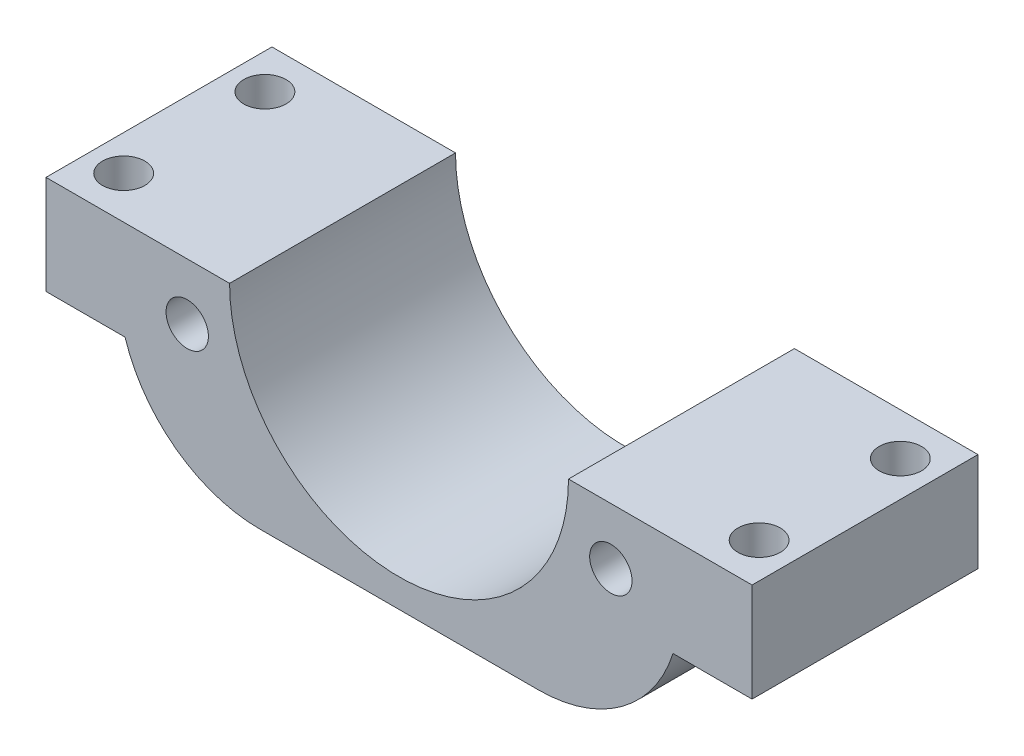
ISO-10303-21;
HEADER;
FILE_DESCRIPTION(('STEP AP214'),'2;1');
FILE_NAME('part.step','',(''),(''),'','','');
FILE_SCHEMA(('AUTOMOTIVE_DESIGN { 1 0 10303 214 1 1 1 1 }'));
ENDSEC;
DATA;
#1=APPLICATION_CONTEXT('core data for automotive mechanical design processes');
#2=APPLICATION_PROTOCOL_DEFINITION('international standard','automotive_design',2000,#1);
#3=PRODUCT_CONTEXT('',#1,'mechanical');
#4=PRODUCT('Part','Part','',(#3));
#5=PRODUCT_RELATED_PRODUCT_CATEGORY('part','',(#4));
#6=PRODUCT_DEFINITION_FORMATION('','',#4);
#7=PRODUCT_DEFINITION_CONTEXT('part definition',#1,'design');
#8=PRODUCT_DEFINITION('design','',#6,#7);
#9=PRODUCT_DEFINITION_SHAPE('','',#8);
#10=(LENGTH_UNIT() NAMED_UNIT(*) SI_UNIT(.MILLI.,.METRE.));
#11=(NAMED_UNIT(*) PLANE_ANGLE_UNIT() SI_UNIT($,.RADIAN.));
#12=(NAMED_UNIT(*) SI_UNIT($,.STERADIAN.) SOLID_ANGLE_UNIT());
#13=UNCERTAINTY_MEASURE_WITH_UNIT(LENGTH_MEASURE(1.E-05),#10,'distance_accuracy_value','');
#14=(GEOMETRIC_REPRESENTATION_CONTEXT(3) GLOBAL_UNCERTAINTY_ASSIGNED_CONTEXT((#13)) GLOBAL_UNIT_ASSIGNED_CONTEXT((#10,
#11,#12)) REPRESENTATION_CONTEXT('',''));
#15=CARTESIAN_POINT('',(0.,0.,0.));
#16=DIRECTION('',(0.,0.,1.));
#17=DIRECTION('',(1.,0.,0.));
#18=AXIS2_PLACEMENT_3D('',#15,#16,#17);
#19=CARTESIAN_POINT('',(23.,14.9,16.));
#20=DIRECTION('',(0.,0.,-1.));
#21=DIRECTION('',(-1.,0.,0.));
#22=AXIS2_PLACEMENT_3D('',#19,#20,#21);
#23=CYLINDRICAL_SURFACE('',#22,12.);
#24=CARTESIAN_POINT('',(23.,14.9,0.));
#25=DIRECTION('',(0.,0.,1.));
#26=DIRECTION('',(1.,0.,0.));
#27=AXIS2_PLACEMENT_3D('',#24,#25,#26);
#28=CIRCLE('',#27,12.);
#29=CARTESIAN_POINT('',(11.,14.9,0.));
#30=VERTEX_POINT('',#29);
#31=CARTESIAN_POINT('',(35.,14.9,0.));
#32=VERTEX_POINT('',#31);
#33=EDGE_CURVE('E117',#30,#32,#28,.T.);
#34=ORIENTED_EDGE('',*,*,#33,.F.);
#35=DIRECTION('',(0.,0.,-1.));
#36=VECTOR('',#35,1.);
#37=CARTESIAN_POINT('',(11.,14.9,16.));
#38=LINE('',#37,#36);
#39=CARTESIAN_POINT('',(11.,14.9,16.));
#40=VERTEX_POINT('',#39);
#41=EDGE_CURVE('E112',#40,#30,#38,.T.);
#42=ORIENTED_EDGE('',*,*,#41,.F.);
#43=CARTESIAN_POINT('',(23.,14.9,16.));
#44=DIRECTION('',(0.,0.,1.));
#45=DIRECTION('',(1.,0.,0.));
#46=AXIS2_PLACEMENT_3D('',#43,#44,#45);
#47=CIRCLE('',#46,12.);
#48=CARTESIAN_POINT('',(35.,14.9,16.));
#49=VERTEX_POINT('',#48);
#50=EDGE_CURVE('E114',#40,#49,#47,.T.);
#51=ORIENTED_EDGE('',*,*,#50,.T.);
#52=DIRECTION('',(0.,0.,-1.));
#53=VECTOR('',#52,1.);
#54=CARTESIAN_POINT('',(35.,14.9,16.));
#55=LINE('',#54,#53);
#56=EDGE_CURVE('E158',#49,#32,#55,.T.);
#57=ORIENTED_EDGE('',*,*,#56,.T.);
#58=EDGE_LOOP('',(#34,#42,#51,#57));
#59=FACE_BOUND('',#58,.T.);
#60=ADVANCED_FACE('F35',(#59),#23,.F.);
#61=CARTESIAN_POINT('',(0.,14.9,16.));
#62=DIRECTION('',(0.,1.,0.));
#63=DIRECTION('',(-1.,0.,0.));
#64=AXIS2_PLACEMENT_3D('',#61,#62,#63);
#65=PLANE('',#64);
#66=CARTESIAN_POINT('',(0.499999999999977,14.9,3.));
#67=DIRECTION('',(0.,-1.,0.));
#68=DIRECTION('',(0.,0.,-1.));
#69=AXIS2_PLACEMENT_3D('',#66,#67,#68);
#70=CIRCLE('',#69,1.5);
#71=CARTESIAN_POINT('',(0.499999999999977,14.9,1.5));
#72=VERTEX_POINT('',#71);
#73=EDGE_CURVE('E305',#72,#72,#70,.T.);
#74=ORIENTED_EDGE('',*,*,#73,.T.);
#75=EDGE_LOOP('',(#74));
#76=FACE_BOUND('',#75,.T.);
#77=CARTESIAN_POINT('',(0.499999999999977,14.9,13.));
#78=DIRECTION('',(0.,-1.,0.));
#79=DIRECTION('',(0.,0.,-1.));
#80=AXIS2_PLACEMENT_3D('',#77,#78,#79);
#81=CIRCLE('',#80,1.5);
#82=CARTESIAN_POINT('',(0.499999999999977,14.9,11.5));
#83=VERTEX_POINT('',#82);
#84=EDGE_CURVE('E161',#83,#83,#81,.T.);
#85=ORIENTED_EDGE('',*,*,#84,.T.);
#86=EDGE_LOOP('',(#85));
#87=FACE_BOUND('',#86,.T.);
#88=DIRECTION('',(1.,0.,0.));
#89=VECTOR('',#88,1.);
#90=CARTESIAN_POINT('',(0.,14.9,0.));
#91=LINE('',#90,#89);
#92=CARTESIAN_POINT('',(-2.00000000000002,14.9,0.));
#93=VERTEX_POINT('',#92);
#94=EDGE_CURVE('E160',#93,#30,#91,.T.);
#95=ORIENTED_EDGE('',*,*,#94,.F.);
#96=DIRECTION('',(0.,0.,-1.));
#97=VECTOR('',#96,1.);
#98=CARTESIAN_POINT('',(-2.00000000000002,14.9,16.));
#99=LINE('',#98,#97);
#100=CARTESIAN_POINT('',(-2.00000000000002,14.9,16.));
#101=VERTEX_POINT('',#100);
#102=EDGE_CURVE('E122',#101,#93,#99,.T.);
#103=ORIENTED_EDGE('',*,*,#102,.F.);
#104=DIRECTION('',(1.,0.,0.));
#105=VECTOR('',#104,1.);
#106=CARTESIAN_POINT('',(0.,14.9,16.));
#107=LINE('',#106,#105);
#108=EDGE_CURVE('E127',#101,#40,#107,.T.);
#109=ORIENTED_EDGE('',*,*,#108,.T.);
#110=ORIENTED_EDGE('',*,*,#41,.T.);
#111=EDGE_LOOP('',(#95,#103,#109,#110));
#112=FACE_BOUND('',#111,.T.);
#113=ADVANCED_FACE('F133',(#76,#87,#112),#65,.T.);
#114=CARTESIAN_POINT('',(-2.00000000000002,0.,16.));
#115=DIRECTION('',(1.,0.,0.));
#116=DIRECTION('',(0.,1.,0.));
#117=AXIS2_PLACEMENT_3D('',#114,#115,#116);
#118=PLANE('',#117);
#119=DIRECTION('',(0.,-1.,0.));
#120=VECTOR('',#119,1.);
#121=CARTESIAN_POINT('',(-2.00000000000002,0.,0.));
#122=LINE('',#121,#120);
#123=CARTESIAN_POINT('',(-2.00000000000002,7.9,0.));
#124=VERTEX_POINT('',#123);
#125=EDGE_CURVE('E163',#93,#124,#122,.T.);
#126=ORIENTED_EDGE('',*,*,#125,.T.);
#127=DIRECTION('',(0.,0.,-1.));
#128=VECTOR('',#127,1.);
#129=CARTESIAN_POINT('',(-2.00000000000002,7.9,16.));
#130=LINE('',#129,#128);
#131=CARTESIAN_POINT('',(-2.00000000000002,7.9,16.));
#132=VERTEX_POINT('',#131);
#133=EDGE_CURVE('E196',#132,#124,#130,.T.);
#134=ORIENTED_EDGE('',*,*,#133,.F.);
#135=DIRECTION('',(0.,-1.,0.));
#136=VECTOR('',#135,1.);
#137=CARTESIAN_POINT('',(-2.00000000000002,0.,16.));
#138=LINE('',#137,#136);
#139=EDGE_CURVE('E135',#101,#132,#138,.T.);
#140=ORIENTED_EDGE('',*,*,#139,.F.);
#141=ORIENTED_EDGE('',*,*,#102,.T.);
#142=EDGE_LOOP('',(#126,#134,#140,#141));
#143=FACE_BOUND('',#142,.T.);
#144=ADVANCED_FACE('F227',(#143),#118,.F.);
#145=CARTESIAN_POINT('',(0.,7.9,16.));
#146=DIRECTION('',(0.,-1.,0.));
#147=DIRECTION('',(0.,0.,-1.));
#148=AXIS2_PLACEMENT_3D('',#145,#146,#147);
#149=PLANE('',#148);
#150=CARTESIAN_POINT('',(0.499999999999977,7.9,3.));
#151=DIRECTION('',(0.,-1.,0.));
#152=DIRECTION('',(0.,0.,-1.));
#153=AXIS2_PLACEMENT_3D('',#150,#151,#152);
#154=CIRCLE('',#153,1.5);
#155=CARTESIAN_POINT('',(0.499999999999977,7.9,1.5));
#156=VERTEX_POINT('',#155);
#157=EDGE_CURVE('E308',#156,#156,#154,.T.);
#158=ORIENTED_EDGE('',*,*,#157,.F.);
#159=EDGE_LOOP('',(#158));
#160=FACE_BOUND('',#159,.T.);
#161=CARTESIAN_POINT('',(0.499999999999977,7.9,13.));
#162=DIRECTION('',(0.,-1.,0.));
#163=DIRECTION('',(0.,0.,-1.));
#164=AXIS2_PLACEMENT_3D('',#161,#162,#163);
#165=CIRCLE('',#164,1.5);
#166=CARTESIAN_POINT('',(0.499999999999977,7.9,11.5));
#167=VERTEX_POINT('',#166);
#168=EDGE_CURVE('E294',#167,#167,#165,.T.);
#169=ORIENTED_EDGE('',*,*,#168,.F.);
#170=EDGE_LOOP('',(#169));
#171=FACE_BOUND('',#170,.T.);
#172=DIRECTION('',(-1.,0.,0.));
#173=VECTOR('',#172,1.);
#174=CARTESIAN_POINT('',(0.,7.9,0.));
#175=LINE('',#174,#173);
#176=CARTESIAN_POINT('',(3.5980762113533,7.9,0.));
#177=VERTEX_POINT('',#176);
#178=EDGE_CURVE('E166',#177,#124,#175,.T.);
#179=ORIENTED_EDGE('',*,*,#178,.F.);
#180=DIRECTION('',(0.,0.,-1.));
#181=VECTOR('',#180,1.);
#182=CARTESIAN_POINT('',(3.5980762113533,7.9,16.));
#183=LINE('',#182,#181);
#184=CARTESIAN_POINT('',(3.5980762113533,7.9,16.));
#185=VERTEX_POINT('',#184);
#186=EDGE_CURVE('E193',#185,#177,#183,.T.);
#187=ORIENTED_EDGE('',*,*,#186,.F.);
#188=DIRECTION('',(-1.,0.,0.));
#189=VECTOR('',#188,1.);
#190=CARTESIAN_POINT('',(0.,7.9,16.));
#191=LINE('',#190,#189);
#192=EDGE_CURVE('E137',#185,#132,#191,.T.);
#193=ORIENTED_EDGE('',*,*,#192,.T.);
#194=ORIENTED_EDGE('',*,*,#133,.T.);
#195=EDGE_LOOP('',(#179,#187,#193,#194));
#196=FACE_BOUND('',#195,.T.);
#197=ADVANCED_FACE('F224',(#160,#171,#196),#149,.T.);
#198=CARTESIAN_POINT('',(0.,0.900000000000003,16.));
#199=DIRECTION('',(0.,1.,0.));
#200=DIRECTION('',(-1.,0.,0.));
#201=AXIS2_PLACEMENT_3D('',#198,#199,#200);
#202=PLANE('',#201);
#203=DIRECTION('',(1.,0.,0.));
#204=VECTOR('',#203,1.);
#205=CARTESIAN_POINT('',(0.,0.900000000000003,16.));
#206=LINE('',#205,#204);
#207=CARTESIAN_POINT('',(13.1374682255228,0.900000000000007,16.));
#208=VERTEX_POINT('',#207);
#209=CARTESIAN_POINT('',(32.8606079858305,0.90000000000001,16.));
#210=VERTEX_POINT('',#209);
#211=EDGE_CURVE('E143',#208,#210,#206,.T.);
#212=ORIENTED_EDGE('',*,*,#211,.F.);
#213=DIRECTION('',(0.,0.,-1.));
#214=VECTOR('',#213,1.);
#215=CARTESIAN_POINT('',(13.1374682255228,0.900000000000006,16.));
#216=LINE('',#215,#214);
#217=CARTESIAN_POINT('',(13.1374682255228,0.900000000000007,0.));
#218=VERTEX_POINT('',#217);
#219=EDGE_CURVE('E200',#208,#218,#216,.T.);
#220=ORIENTED_EDGE('',*,*,#219,.T.);
#221=DIRECTION('',(1.,0.,0.));
#222=VECTOR('',#221,1.);
#223=CARTESIAN_POINT('',(0.,0.900000000000003,0.));
#224=LINE('',#223,#222);
#225=CARTESIAN_POINT('',(32.8606079858305,0.90000000000001,0.));
#226=VERTEX_POINT('',#225);
#227=EDGE_CURVE('E169',#218,#226,#224,.T.);
#228=ORIENTED_EDGE('',*,*,#227,.T.);
#229=DIRECTION('',(0.,0.,-1.));
#230=VECTOR('',#229,1.);
#231=CARTESIAN_POINT('',(32.8606079858305,0.90000000000001,16.));
#232=LINE('',#231,#230);
#233=EDGE_CURVE('E50',#226,#210,#232,.F.);
#234=ORIENTED_EDGE('',*,*,#233,.T.);
#235=EDGE_LOOP('',(#212,#220,#228,#234));
#236=FACE_BOUND('',#235,.T.);
#237=ADVANCED_FACE('F217',(#236),#202,.F.);
#238=CARTESIAN_POINT('',(0.,7.9,16.));
#239=DIRECTION('',(0.,-1.,0.));
#240=DIRECTION('',(1.,0.,0.));
#241=AXIS2_PLACEMENT_3D('',#238,#239,#240);
#242=PLANE('',#241);
#243=CARTESIAN_POINT('',(45.5,7.9,3.));
#244=DIRECTION('',(0.,-1.,0.));
#245=DIRECTION('',(0.,0.,-1.));
#246=AXIS2_PLACEMENT_3D('',#243,#244,#245);
#247=CIRCLE('',#246,1.5);
#248=CARTESIAN_POINT('',(45.5,7.9,1.5));
#249=VERTEX_POINT('',#248);
#250=EDGE_CURVE('E302',#249,#249,#247,.T.);
#251=ORIENTED_EDGE('',*,*,#250,.F.);
#252=EDGE_LOOP('',(#251));
#253=FACE_BOUND('',#252,.T.);
#254=CARTESIAN_POINT('',(45.5,7.9,13.));
#255=DIRECTION('',(0.,-1.,0.));
#256=DIRECTION('',(0.,0.,-1.));
#257=AXIS2_PLACEMENT_3D('',#254,#255,#256);
#258=CIRCLE('',#257,1.5);
#259=CARTESIAN_POINT('',(45.5,7.9,11.5));
#260=VERTEX_POINT('',#259);
#261=EDGE_CURVE('E295',#260,#260,#258,.T.);
#262=ORIENTED_EDGE('',*,*,#261,.F.);
#263=EDGE_LOOP('',(#262));
#264=FACE_BOUND('',#263,.T.);
#265=DIRECTION('',(-1.,0.,0.));
#266=VECTOR('',#265,1.);
#267=CARTESIAN_POINT('',(0.,7.9,0.));
#268=LINE('',#267,#266);
#269=CARTESIAN_POINT('',(48.,7.90000000000001,0.));
#270=VERTEX_POINT('',#269);
#271=CARTESIAN_POINT('',(42.4,7.90000000000001,0.));
#272=VERTEX_POINT('',#271);
#273=EDGE_CURVE('E171',#270,#272,#268,.T.);
#274=ORIENTED_EDGE('',*,*,#273,.F.);
#275=DIRECTION('',(0.,0.,-1.));
#276=VECTOR('',#275,1.);
#277=CARTESIAN_POINT('',(48.,7.90000000000001,16.));
#278=LINE('',#277,#276);
#279=CARTESIAN_POINT('',(48.,7.90000000000001,16.));
#280=VERTEX_POINT('',#279);
#281=EDGE_CURVE('E188',#280,#270,#278,.T.);
#282=ORIENTED_EDGE('',*,*,#281,.F.);
#283=DIRECTION('',(-1.,0.,0.));
#284=VECTOR('',#283,1.);
#285=CARTESIAN_POINT('',(0.,7.9,16.));
#286=LINE('',#285,#284);
#287=CARTESIAN_POINT('',(42.4,7.90000000000001,16.));
#288=VERTEX_POINT('',#287);
#289=EDGE_CURVE('E145',#280,#288,#286,.T.);
#290=ORIENTED_EDGE('',*,*,#289,.T.);
#291=DIRECTION('',(0.,0.,-1.));
#292=VECTOR('',#291,1.);
#293=CARTESIAN_POINT('',(42.4,7.90000000000001,16.));
#294=LINE('',#293,#292);
#295=EDGE_CURVE('E190',#288,#272,#294,.T.);
#296=ORIENTED_EDGE('',*,*,#295,.T.);
#297=EDGE_LOOP('',(#274,#282,#290,#296));
#298=FACE_BOUND('',#297,.T.);
#299=ADVANCED_FACE('F212',(#253,#264,#298),#242,.T.);
#300=CARTESIAN_POINT('',(48.,0.,16.));
#301=DIRECTION('',(1.,0.,0.));
#302=DIRECTION('',(0.,1.,0.));
#303=AXIS2_PLACEMENT_3D('',#300,#301,#302);
#304=PLANE('',#303);
#305=DIRECTION('',(0.,-1.,0.));
#306=VECTOR('',#305,1.);
#307=CARTESIAN_POINT('',(48.,0.,0.));
#308=LINE('',#307,#306);
#309=CARTESIAN_POINT('',(48.,14.9,0.));
#310=VERTEX_POINT('',#309);
#311=EDGE_CURVE('E174',#310,#270,#308,.T.);
#312=ORIENTED_EDGE('',*,*,#311,.F.);
#313=DIRECTION('',(0.,0.,-1.));
#314=VECTOR('',#313,1.);
#315=CARTESIAN_POINT('',(48.,14.9,16.));
#316=LINE('',#315,#314);
#317=CARTESIAN_POINT('',(48.,14.9,16.));
#318=VERTEX_POINT('',#317);
#319=EDGE_CURVE('E186',#318,#310,#316,.T.);
#320=ORIENTED_EDGE('',*,*,#319,.F.);
#321=DIRECTION('',(0.,-1.,0.));
#322=VECTOR('',#321,1.);
#323=CARTESIAN_POINT('',(48.,0.,16.));
#324=LINE('',#323,#322);
#325=EDGE_CURVE('E148',#318,#280,#324,.T.);
#326=ORIENTED_EDGE('',*,*,#325,.T.);
#327=ORIENTED_EDGE('',*,*,#281,.T.);
#328=EDGE_LOOP('',(#312,#320,#326,#327));
#329=FACE_BOUND('',#328,.T.);
#330=ADVANCED_FACE('F233',(#329),#304,.T.);
#331=CARTESIAN_POINT('',(38.,10.9,16.));
#332=DIRECTION('',(0.,0.,-1.));
#333=DIRECTION('',(-1.,0.,0.));
#334=AXIS2_PLACEMENT_3D('',#331,#332,#333);
#335=CYLINDRICAL_SURFACE('',#334,1.5);
#336=CARTESIAN_POINT('',(38.,10.9,16.));
#337=DIRECTION('',(0.,0.,1.));
#338=DIRECTION('',(1.,0.,0.));
#339=AXIS2_PLACEMENT_3D('',#336,#337,#338);
#340=CIRCLE('',#339,1.5);
#341=CARTESIAN_POINT('',(39.5,10.9,16.));
#342=VERTEX_POINT('',#341);
#343=EDGE_CURVE('E152',#342,#342,#340,.T.);
#344=ORIENTED_EDGE('',*,*,#343,.T.);
#345=EDGE_LOOP('',(#344));
#346=FACE_BOUND('',#345,.T.);
#347=CARTESIAN_POINT('',(38.,10.9,0.));
#348=DIRECTION('',(0.,0.,1.));
#349=DIRECTION('',(1.,0.,0.));
#350=AXIS2_PLACEMENT_3D('',#347,#348,#349);
#351=CIRCLE('',#350,1.5);
#352=CARTESIAN_POINT('',(39.5,10.9,0.));
#353=VERTEX_POINT('',#352);
#354=EDGE_CURVE('E180',#353,#353,#351,.T.);
#355=ORIENTED_EDGE('',*,*,#354,.F.);
#356=EDGE_LOOP('',(#355));
#357=FACE_BOUND('',#356,.T.);
#358=ADVANCED_FACE('F235',(#346,#357),#335,.F.);
#359=CARTESIAN_POINT('',(0.,14.9,16.));
#360=DIRECTION('',(0.,1.,0.));
#361=DIRECTION('',(-1.,0.,0.));
#362=AXIS2_PLACEMENT_3D('',#359,#360,#361);
#363=PLANE('',#362);
#364=CARTESIAN_POINT('',(45.5,14.9,3.));
#365=DIRECTION('',(0.,-1.,0.));
#366=DIRECTION('',(0.,0.,-1.));
#367=AXIS2_PLACEMENT_3D('',#364,#365,#366);
#368=CIRCLE('',#367,1.5);
#369=CARTESIAN_POINT('',(45.5,14.9,1.5));
#370=VERTEX_POINT('',#369);
#371=EDGE_CURVE('E289',#370,#370,#368,.T.);
#372=ORIENTED_EDGE('',*,*,#371,.T.);
#373=EDGE_LOOP('',(#372));
#374=FACE_BOUND('',#373,.T.);
#375=CARTESIAN_POINT('',(45.5,14.9,13.));
#376=DIRECTION('',(0.,-1.,0.));
#377=DIRECTION('',(0.,0.,-1.));
#378=AXIS2_PLACEMENT_3D('',#375,#376,#377);
#379=CIRCLE('',#378,1.5);
#380=CARTESIAN_POINT('',(45.5,14.9,11.5));
#381=VERTEX_POINT('',#380);
#382=EDGE_CURVE('E292',#381,#381,#379,.T.);
#383=ORIENTED_EDGE('',*,*,#382,.T.);
#384=EDGE_LOOP('',(#383));
#385=FACE_BOUND('',#384,.T.);
#386=DIRECTION('',(1.,0.,0.));
#387=VECTOR('',#386,1.);
#388=CARTESIAN_POINT('',(0.,14.9,0.));
#389=LINE('',#388,#387);
#390=EDGE_CURVE('E177',#32,#310,#389,.T.);
#391=ORIENTED_EDGE('',*,*,#390,.F.);
#392=ORIENTED_EDGE('',*,*,#56,.F.);
#393=DIRECTION('',(1.,0.,0.));
#394=VECTOR('',#393,1.);
#395=CARTESIAN_POINT('',(0.,14.9,16.));
#396=LINE('',#395,#394);
#397=EDGE_CURVE('E130',#49,#318,#396,.T.);
#398=ORIENTED_EDGE('',*,*,#397,.T.);
#399=ORIENTED_EDGE('',*,*,#319,.T.);
#400=EDGE_LOOP('',(#391,#392,#398,#399));
#401=FACE_BOUND('',#400,.T.);
#402=ADVANCED_FACE('F230',(#374,#385,#401),#363,.T.);
#403=CARTESIAN_POINT('',(7.99999999999999,10.9,16.));
#404=DIRECTION('',(0.,0.,-1.));
#405=DIRECTION('',(-1.,0.,0.));
#406=AXIS2_PLACEMENT_3D('',#403,#404,#405);
#407=CYLINDRICAL_SURFACE('',#406,1.5);
#408=CARTESIAN_POINT('',(7.99999999999999,10.9,16.));
#409=DIRECTION('',(0.,0.,1.));
#410=DIRECTION('',(1.,0.,0.));
#411=AXIS2_PLACEMENT_3D('',#408,#409,#410);
#412=CIRCLE('',#411,1.5);
#413=CARTESIAN_POINT('',(9.49999999999998,10.9,16.));
#414=VERTEX_POINT('',#413);
#415=EDGE_CURVE('E155',#414,#414,#412,.T.);
#416=ORIENTED_EDGE('',*,*,#415,.T.);
#417=EDGE_LOOP('',(#416));
#418=FACE_BOUND('',#417,.T.);
#419=CARTESIAN_POINT('',(7.99999999999999,10.9,0.));
#420=DIRECTION('',(0.,0.,1.));
#421=DIRECTION('',(1.,0.,0.));
#422=AXIS2_PLACEMENT_3D('',#419,#420,#421);
#423=CIRCLE('',#422,1.5);
#424=CARTESIAN_POINT('',(9.49999999999998,10.9,0.));
#425=VERTEX_POINT('',#424);
#426=EDGE_CURVE('E131',#425,#425,#423,.T.);
#427=ORIENTED_EDGE('',*,*,#426,.F.);
#428=EDGE_LOOP('',(#427));
#429=FACE_BOUND('',#428,.T.);
#430=ADVANCED_FACE('F276',(#418,#429),#407,.F.);
#431=CARTESIAN_POINT('',(0.,0.,16.));
#432=DIRECTION('',(0.,0.,1.));
#433=DIRECTION('',(1.,0.,0.));
#434=AXIS2_PLACEMENT_3D('',#431,#432,#433);
#435=PLANE('',#434);
#436=ORIENTED_EDGE('',*,*,#192,.F.);
#437=CARTESIAN_POINT('',(13.1374682255228,10.9,16.));
#438=DIRECTION('',(0.,0.,1.));
#439=DIRECTION('',(1.,0.,0.));
#440=AXIS2_PLACEMENT_3D('',#437,#438,#439);
#441=CIRCLE('',#440,10.);
#442=EDGE_CURVE('E11',#185,#208,#441,.T.);
#443=ORIENTED_EDGE('',*,*,#442,.T.);
#444=ORIENTED_EDGE('',*,*,#211,.T.);
#445=CARTESIAN_POINT('',(32.8606079858305,10.9,16.));
#446=DIRECTION('',(0.,0.,1.));
#447=DIRECTION('',(1.,0.,0.));
#448=AXIS2_PLACEMENT_3D('',#445,#446,#447);
#449=CIRCLE('',#448,10.);
#450=EDGE_CURVE('E43',#210,#288,#449,.T.);
#451=ORIENTED_EDGE('',*,*,#450,.T.);
#452=ORIENTED_EDGE('',*,*,#289,.F.);
#453=ORIENTED_EDGE('',*,*,#325,.F.);
#454=ORIENTED_EDGE('',*,*,#397,.F.);
#455=ORIENTED_EDGE('',*,*,#50,.F.);
#456=ORIENTED_EDGE('',*,*,#108,.F.);
#457=ORIENTED_EDGE('',*,*,#139,.T.);
#458=EDGE_LOOP('',(#436,#443,#444,#451,#452,#453,#454,#455,#456,#457));
#459=FACE_BOUND('',#458,.T.);
#460=ORIENTED_EDGE('',*,*,#343,.F.);
#461=EDGE_LOOP('',(#460));
#462=FACE_BOUND('',#461,.T.);
#463=ORIENTED_EDGE('',*,*,#415,.F.);
#464=EDGE_LOOP('',(#463));
#465=FACE_BOUND('',#464,.T.);
#466=ADVANCED_FACE('F125',(#459,#462,#465),#435,.T.);
#467=CARTESIAN_POINT('',(0.,0.,0.));
#468=DIRECTION('',(0.,0.,1.));
#469=DIRECTION('',(1.,0.,0.));
#470=AXIS2_PLACEMENT_3D('',#467,#468,#469);
#471=PLANE('',#470);
#472=ORIENTED_EDGE('',*,*,#227,.F.);
#473=CARTESIAN_POINT('',(13.1374682255228,10.9,0.));
#474=DIRECTION('',(0.,0.,1.));
#475=DIRECTION('',(1.,0.,0.));
#476=AXIS2_PLACEMENT_3D('',#473,#474,#475);
#477=CIRCLE('',#476,10.);
#478=EDGE_CURVE('E205',#218,#177,#477,.F.);
#479=ORIENTED_EDGE('',*,*,#478,.T.);
#480=ORIENTED_EDGE('',*,*,#178,.T.);
#481=ORIENTED_EDGE('',*,*,#125,.F.);
#482=ORIENTED_EDGE('',*,*,#94,.T.);
#483=ORIENTED_EDGE('',*,*,#33,.T.);
#484=ORIENTED_EDGE('',*,*,#390,.T.);
#485=ORIENTED_EDGE('',*,*,#311,.T.);
#486=ORIENTED_EDGE('',*,*,#273,.T.);
#487=CARTESIAN_POINT('',(32.8606079858305,10.9,0.));
#488=DIRECTION('',(0.,0.,1.));
#489=DIRECTION('',(1.,0.,0.));
#490=AXIS2_PLACEMENT_3D('',#487,#488,#489);
#491=CIRCLE('',#490,10.);
#492=EDGE_CURVE('E203',#272,#226,#491,.F.);
#493=ORIENTED_EDGE('',*,*,#492,.T.);
#494=EDGE_LOOP('',(#472,#479,#480,#481,#482,#483,#484,#485,#486,#493));
#495=FACE_BOUND('',#494,.T.);
#496=ORIENTED_EDGE('',*,*,#354,.T.);
#497=EDGE_LOOP('',(#496));
#498=FACE_BOUND('',#497,.T.);
#499=ORIENTED_EDGE('',*,*,#426,.T.);
#500=EDGE_LOOP('',(#499));
#501=FACE_BOUND('',#500,.T.);
#502=ADVANCED_FACE('F215',(#495,#498,#501),#471,.F.);
#503=CARTESIAN_POINT('',(45.5,14.9,13.));
#504=DIRECTION('',(0.,-1.,0.));
#505=DIRECTION('',(0.,0.,-1.));
#506=AXIS2_PLACEMENT_3D('',#503,#504,#505);
#507=CYLINDRICAL_SURFACE('',#506,1.5);
#508=ORIENTED_EDGE('',*,*,#382,.F.);
#509=EDGE_LOOP('',(#508));
#510=FACE_BOUND('',#509,.T.);
#511=ORIENTED_EDGE('',*,*,#261,.T.);
#512=EDGE_LOOP('',(#511));
#513=FACE_BOUND('',#512,.T.);
#514=ADVANCED_FACE('F279',(#510,#513),#507,.F.);
#515=CARTESIAN_POINT('',(45.5,14.9,3.));
#516=DIRECTION('',(0.,-1.,0.));
#517=DIRECTION('',(0.,0.,-1.));
#518=AXIS2_PLACEMENT_3D('',#515,#516,#517);
#519=CYLINDRICAL_SURFACE('',#518,1.5);
#520=ORIENTED_EDGE('',*,*,#371,.F.);
#521=EDGE_LOOP('',(#520));
#522=FACE_BOUND('',#521,.T.);
#523=ORIENTED_EDGE('',*,*,#250,.T.);
#524=EDGE_LOOP('',(#523));
#525=FACE_BOUND('',#524,.T.);
#526=ADVANCED_FACE('F266',(#522,#525),#519,.F.);
#527=CARTESIAN_POINT('',(0.499999999999977,14.9,13.));
#528=DIRECTION('',(0.,-1.,0.));
#529=DIRECTION('',(0.,0.,-1.));
#530=AXIS2_PLACEMENT_3D('',#527,#528,#529);
#531=CYLINDRICAL_SURFACE('',#530,1.5);
#532=ORIENTED_EDGE('',*,*,#84,.F.);
#533=EDGE_LOOP('',(#532));
#534=FACE_BOUND('',#533,.T.);
#535=ORIENTED_EDGE('',*,*,#168,.T.);
#536=EDGE_LOOP('',(#535));
#537=FACE_BOUND('',#536,.T.);
#538=ADVANCED_FACE('F260',(#534,#537),#531,.F.);
#539=CARTESIAN_POINT('',(0.499999999999977,14.9,3.));
#540=DIRECTION('',(0.,-1.,0.));
#541=DIRECTION('',(0.,0.,-1.));
#542=AXIS2_PLACEMENT_3D('',#539,#540,#541);
#543=CYLINDRICAL_SURFACE('',#542,1.5);
#544=ORIENTED_EDGE('',*,*,#73,.F.);
#545=EDGE_LOOP('',(#544));
#546=FACE_BOUND('',#545,.T.);
#547=ORIENTED_EDGE('',*,*,#157,.T.);
#548=EDGE_LOOP('',(#547));
#549=FACE_BOUND('',#548,.T.);
#550=ADVANCED_FACE('F255',(#546,#549),#543,.F.);
#551=CARTESIAN_POINT('',(13.1374682255228,10.9,16.));
#552=DIRECTION('',(0.,0.,-1.));
#553=DIRECTION('',(-1.,0.,0.));
#554=AXIS2_PLACEMENT_3D('',#551,#552,#553);
#555=CYLINDRICAL_SURFACE('',#554,10.);
#556=ORIENTED_EDGE('',*,*,#442,.F.);
#557=ORIENTED_EDGE('',*,*,#186,.T.);
#558=ORIENTED_EDGE('',*,*,#478,.F.);
#559=ORIENTED_EDGE('',*,*,#219,.F.);
#560=EDGE_LOOP('',(#556,#557,#558,#559));
#561=FACE_BOUND('',#560,.T.);
#562=ADVANCED_FACE('F220',(#561),#555,.T.);
#563=CARTESIAN_POINT('',(32.8606079858305,10.9,16.));
#564=DIRECTION('',(0.,0.,-1.));
#565=DIRECTION('',(-1.,0.,0.));
#566=AXIS2_PLACEMENT_3D('',#563,#564,#565);
#567=CYLINDRICAL_SURFACE('',#566,10.);
#568=ORIENTED_EDGE('',*,*,#450,.F.);
#569=ORIENTED_EDGE('',*,*,#233,.F.);
#570=ORIENTED_EDGE('',*,*,#492,.F.);
#571=ORIENTED_EDGE('',*,*,#295,.F.);
#572=EDGE_LOOP('',(#568,#569,#570,#571));
#573=FACE_BOUND('',#572,.T.);
#574=ADVANCED_FACE('F37',(#573),#567,.T.);
#575=CLOSED_SHELL('',(#60,#113,#144,#197,#237,#299,#330,#358,#402,#430,#466,#502,#514,#526,#538,
#550,#562,#574));
#576=MANIFOLD_SOLID_BREP('B2',#575);
#577=ADVANCED_BREP_SHAPE_REPRESENTATION('',(#18,#576),#14);
#578=SHAPE_DEFINITION_REPRESENTATION(#9,#577);
ENDSEC;
END-ISO-10303-21;
